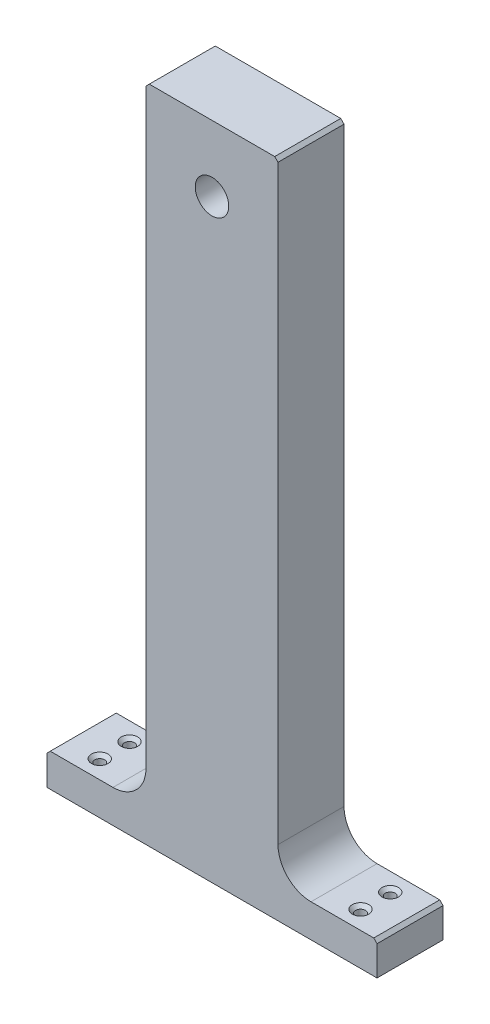
ISO-10303-21;
HEADER;
FILE_DESCRIPTION(('STEP AP214'),'2;1');
FILE_NAME('part.step','',(''),(''),'','','');
FILE_SCHEMA(('AUTOMOTIVE_DESIGN { 1 0 10303 214 1 1 1 1 }'));
ENDSEC;
DATA;
#1=APPLICATION_CONTEXT('core data for automotive mechanical design processes');
#2=APPLICATION_PROTOCOL_DEFINITION('international standard','automotive_design',2000,#1);
#3=PRODUCT_CONTEXT('',#1,'mechanical');
#4=PRODUCT('Part','Part','',(#3));
#5=PRODUCT_RELATED_PRODUCT_CATEGORY('part','',(#4));
#6=PRODUCT_DEFINITION_FORMATION('','',#4);
#7=PRODUCT_DEFINITION_CONTEXT('part definition',#1,'design');
#8=PRODUCT_DEFINITION('design','',#6,#7);
#9=PRODUCT_DEFINITION_SHAPE('','',#8);
#10=(LENGTH_UNIT() NAMED_UNIT(*) SI_UNIT(.MILLI.,.METRE.));
#11=(NAMED_UNIT(*) PLANE_ANGLE_UNIT() SI_UNIT($,.RADIAN.));
#12=(NAMED_UNIT(*) SI_UNIT($,.STERADIAN.) SOLID_ANGLE_UNIT());
#13=UNCERTAINTY_MEASURE_WITH_UNIT(LENGTH_MEASURE(1.E-05),#10,'distance_accuracy_value','');
#14=(GEOMETRIC_REPRESENTATION_CONTEXT(3) GLOBAL_UNCERTAINTY_ASSIGNED_CONTEXT((#13)) GLOBAL_UNIT_ASSIGNED_CONTEXT((#10,
#11,#12)) REPRESENTATION_CONTEXT('',''));
#15=CARTESIAN_POINT('',(0.,0.,0.));
#16=DIRECTION('',(0.,0.,1.));
#17=DIRECTION('',(1.,0.,0.));
#18=AXIS2_PLACEMENT_3D('',#15,#16,#17);
#19=CARTESIAN_POINT('',(158.68544600939,16.4301183127146,20.));
#20=DIRECTION('',(0.,1.,0.));
#21=DIRECTION('',(0.,0.,1.));
#22=AXIS2_PLACEMENT_3D('',#19,#20,#21);
#23=PLANE('',#22);
#24=CARTESIAN_POINT('',(178.18544600939,16.4301183127146,5.5));
#25=DIRECTION('',(0.,1.,0.));
#26=DIRECTION('',(0.,0.,1.));
#27=AXIS2_PLACEMENT_3D('',#24,#25,#26);
#28=CIRCLE('',#27,1.5);
#29=CARTESIAN_POINT('',(178.18544600939,16.4301183127146,7.));
#30=VERTEX_POINT('',#29);
#31=EDGE_CURVE('E224',#30,#30,#28,.T.);
#32=ORIENTED_EDGE('',*,*,#31,.T.);
#33=EDGE_LOOP('',(#32));
#34=FACE_BOUND('',#33,.T.);
#35=CARTESIAN_POINT('',(178.18544600939,16.4301183127146,14.5));
#36=DIRECTION('',(0.,1.,0.));
#37=DIRECTION('',(0.,0.,1.));
#38=AXIS2_PLACEMENT_3D('',#35,#36,#37);
#39=CIRCLE('',#38,1.5);
#40=CARTESIAN_POINT('',(178.18544600939,16.4301183127146,16.));
#41=VERTEX_POINT('',#40);
#42=EDGE_CURVE('E221',#41,#41,#39,.T.);
#43=ORIENTED_EDGE('',*,*,#42,.T.);
#44=EDGE_LOOP('',(#43));
#45=FACE_BOUND('',#44,.T.);
#46=DIRECTION('',(1.,0.,0.));
#47=VECTOR('',#46,1.);
#48=CARTESIAN_POINT('',(158.68544600939,16.4301183127146,0.));
#49=LINE('',#48,#47);
#50=CARTESIAN_POINT('',(88.6854460093897,16.4301183127146,0.));
#51=VERTEX_POINT('',#50);
#52=CARTESIAN_POINT('',(188.68544600939,16.4301183127146,0.));
#53=VERTEX_POINT('',#52);
#54=EDGE_CURVE('E226',#51,#53,#49,.T.);
#55=ORIENTED_EDGE('',*,*,#54,.T.);
#56=DIRECTION('',(0.,0.,-1.));
#57=VECTOR('',#56,1.);
#58=CARTESIAN_POINT('',(188.68544600939,16.4301183127146,20.));
#59=LINE('',#58,#57);
#60=CARTESIAN_POINT('',(188.68544600939,16.4301183127146,20.));
#61=VERTEX_POINT('',#60);
#62=EDGE_CURVE('E151',#61,#53,#59,.T.);
#63=ORIENTED_EDGE('',*,*,#62,.F.);
#64=DIRECTION('',(1.,0.,0.));
#65=VECTOR('',#64,1.);
#66=CARTESIAN_POINT('',(138.68544600939,16.4301183127146,20.));
#67=LINE('',#66,#65);
#68=CARTESIAN_POINT('',(88.6854460093897,16.4301183127146,20.));
#69=VERTEX_POINT('',#68);
#70=EDGE_CURVE('E145',#69,#61,#67,.T.);
#71=ORIENTED_EDGE('',*,*,#70,.F.);
#72=DIRECTION('',(0.,0.,-1.));
#73=VECTOR('',#72,1.);
#74=CARTESIAN_POINT('',(88.6854460093897,16.4301183127146,20.));
#75=LINE('',#74,#73);
#76=EDGE_CURVE('E149',#69,#51,#75,.T.);
#77=ORIENTED_EDGE('',*,*,#76,.T.);
#78=EDGE_LOOP('',(#55,#63,#71,#77));
#79=FACE_BOUND('',#78,.T.);
#80=CARTESIAN_POINT('',(99.1854460093897,16.4301183127146,5.5));
#81=DIRECTION('',(0.,-1.,0.));
#82=DIRECTION('',(0.,0.,1.));
#83=AXIS2_PLACEMENT_3D('',#80,#81,#82);
#84=CIRCLE('',#83,1.5);
#85=CARTESIAN_POINT('',(99.1854460093897,16.4301183127146,7.));
#86=VERTEX_POINT('',#85);
#87=EDGE_CURVE('E368',#86,#86,#84,.T.);
#88=ORIENTED_EDGE('',*,*,#87,.F.);
#89=EDGE_LOOP('',(#88));
#90=FACE_BOUND('',#89,.T.);
#91=CARTESIAN_POINT('',(99.1854460093897,16.4301183127146,14.5));
#92=DIRECTION('',(0.,-1.,0.));
#93=DIRECTION('',(0.,0.,1.));
#94=AXIS2_PLACEMENT_3D('',#91,#92,#93);
#95=CIRCLE('',#94,1.5);
#96=CARTESIAN_POINT('',(99.1854460093897,16.4301183127146,16.));
#97=VERTEX_POINT('',#96);
#98=EDGE_CURVE('E569',#97,#97,#95,.T.);
#99=ORIENTED_EDGE('',*,*,#98,.F.);
#100=EDGE_LOOP('',(#99));
#101=FACE_BOUND('',#100,.T.);
#102=ADVANCED_FACE('F41',(#34,#45,#79,#90,#101),#23,.F.);
#103=CARTESIAN_POINT('',(188.68544600939,16.4301183127146,20.));
#104=DIRECTION('',(-1.,0.,0.));
#105=DIRECTION('',(0.,0.,1.));
#106=AXIS2_PLACEMENT_3D('',#103,#104,#105);
#107=PLANE('',#106);
#108=DIRECTION('',(0.,1.,0.));
#109=VECTOR('',#108,1.);
#110=CARTESIAN_POINT('',(188.68544600939,16.4301183127146,0.));
#111=LINE('',#110,#109);
#112=CARTESIAN_POINT('',(188.68544600939,25.4301183127146,0.));
#113=VERTEX_POINT('',#112);
#114=EDGE_CURVE('E239',#53,#113,#111,.T.);
#115=ORIENTED_EDGE('',*,*,#114,.T.);
#116=DIRECTION('',(0.,0.,1.));
#117=VECTOR('',#116,1.);
#118=CARTESIAN_POINT('',(188.68544600939,25.4301183127146,20.));
#119=LINE('',#118,#117);
#120=CARTESIAN_POINT('',(188.68544600939,25.4301183127146,20.));
#121=VERTEX_POINT('',#120);
#122=EDGE_CURVE('E269',#113,#121,#119,.T.);
#123=ORIENTED_EDGE('',*,*,#122,.T.);
#124=DIRECTION('',(0.,1.,0.));
#125=VECTOR('',#124,1.);
#126=CARTESIAN_POINT('',(188.68544600939,16.4301183127146,20.));
#127=LINE('',#126,#125);
#128=EDGE_CURVE('E154',#61,#121,#127,.T.);
#129=ORIENTED_EDGE('',*,*,#128,.F.);
#130=ORIENTED_EDGE('',*,*,#62,.T.);
#131=EDGE_LOOP('',(#115,#123,#129,#130));
#132=FACE_BOUND('',#131,.T.);
#133=ADVANCED_FACE('F303',(#132),#107,.F.);
#134=CARTESIAN_POINT('',(158.68544600939,26.4301183127146,20.));
#135=DIRECTION('',(0.,-1.,0.));
#136=DIRECTION('',(0.,0.,-1.));
#137=AXIS2_PLACEMENT_3D('',#134,#135,#136);
#138=PLANE('',#137);
#139=CARTESIAN_POINT('',(178.18544600939,26.4301183127146,14.5));
#140=DIRECTION('',(0.,-1.,0.));
#141=DIRECTION('',(0.,0.,-1.));
#142=AXIS2_PLACEMENT_3D('',#139,#140,#141);
#143=CIRCLE('',#142,2.49999999999997);
#144=CARTESIAN_POINT('',(178.18544600939,26.4301183127146,12.));
#145=VERTEX_POINT('',#144);
#146=EDGE_CURVE('E50',#145,#145,#143,.T.);
#147=ORIENTED_EDGE('',*,*,#146,.T.);
#148=EDGE_LOOP('',(#147));
#149=FACE_BOUND('',#148,.T.);
#150=CARTESIAN_POINT('',(178.18544600939,26.4301183127146,5.5));
#151=DIRECTION('',(0.,-1.,0.));
#152=DIRECTION('',(0.,0.,-1.));
#153=AXIS2_PLACEMENT_3D('',#150,#151,#152);
#154=CIRCLE('',#153,2.49999999999998);
#155=CARTESIAN_POINT('',(178.18544600939,26.4301183127146,3.00000000000003));
#156=VERTEX_POINT('',#155);
#157=EDGE_CURVE('E281',#156,#156,#154,.T.);
#158=ORIENTED_EDGE('',*,*,#157,.T.);
#159=EDGE_LOOP('',(#158));
#160=FACE_BOUND('',#159,.T.);
#161=DIRECTION('',(-1.,0.,0.));
#162=VECTOR('',#161,1.);
#163=CARTESIAN_POINT('',(158.68544600939,26.4301183127146,20.));
#164=LINE('',#163,#162);
#165=CARTESIAN_POINT('',(187.68544600939,26.4301183127146,20.));
#166=VERTEX_POINT('',#165);
#167=CARTESIAN_POINT('',(168.68544600939,26.4301183127146,20.));
#168=VERTEX_POINT('',#167);
#169=EDGE_CURVE('E229',#166,#168,#164,.T.);
#170=ORIENTED_EDGE('',*,*,#169,.F.);
#171=DIRECTION('',(0.,0.,-1.));
#172=VECTOR('',#171,1.);
#173=CARTESIAN_POINT('',(187.68544600939,26.4301183127146,20.));
#174=LINE('',#173,#172);
#175=CARTESIAN_POINT('',(187.68544600939,26.4301183127146,0.));
#176=VERTEX_POINT('',#175);
#177=EDGE_CURVE('E262',#166,#176,#174,.T.);
#178=ORIENTED_EDGE('',*,*,#177,.T.);
#179=DIRECTION('',(-1.,0.,0.));
#180=VECTOR('',#179,1.);
#181=CARTESIAN_POINT('',(158.68544600939,26.4301183127146,0.));
#182=LINE('',#181,#180);
#183=CARTESIAN_POINT('',(168.68544600939,26.4301183127146,0.));
#184=VERTEX_POINT('',#183);
#185=EDGE_CURVE('E242',#176,#184,#182,.T.);
#186=ORIENTED_EDGE('',*,*,#185,.T.);
#187=DIRECTION('',(0.,0.,-1.));
#188=VECTOR('',#187,1.);
#189=CARTESIAN_POINT('',(168.68544600939,26.4301183127146,20.));
#190=LINE('',#189,#188);
#191=EDGE_CURVE('E254',#184,#168,#190,.F.);
#192=ORIENTED_EDGE('',*,*,#191,.T.);
#193=EDGE_LOOP('',(#170,#178,#186,#192));
#194=FACE_BOUND('',#193,.T.);
#195=ADVANCED_FACE('F286',(#149,#160,#194),#138,.F.);
#196=CARTESIAN_POINT('',(158.68544600939,26.4301183127146,20.));
#197=DIRECTION('',(-1.,0.,0.));
#198=DIRECTION('',(0.,0.,1.));
#199=AXIS2_PLACEMENT_3D('',#196,#197,#198);
#200=PLANE('',#199);
#201=DIRECTION('',(0.,1.,0.));
#202=VECTOR('',#201,1.);
#203=CARTESIAN_POINT('',(158.68544600939,26.4301183127146,0.));
#204=LINE('',#203,#202);
#205=CARTESIAN_POINT('',(158.68544600939,36.4301183127146,0.));
#206=VERTEX_POINT('',#205);
#207=CARTESIAN_POINT('',(158.68544600939,215.430118312715,0.));
#208=VERTEX_POINT('',#207);
#209=EDGE_CURVE('E244',#206,#208,#204,.T.);
#210=ORIENTED_EDGE('',*,*,#209,.T.);
#211=DIRECTION('',(0.,0.,1.));
#212=VECTOR('',#211,1.);
#213=CARTESIAN_POINT('',(158.68544600939,215.430118312715,20.));
#214=LINE('',#213,#212);
#215=CARTESIAN_POINT('',(158.68544600939,215.430118312715,20.));
#216=VERTEX_POINT('',#215);
#217=EDGE_CURVE('E65',#208,#216,#214,.T.);
#218=ORIENTED_EDGE('',*,*,#217,.T.);
#219=DIRECTION('',(0.,1.,0.));
#220=VECTOR('',#219,1.);
#221=CARTESIAN_POINT('',(158.68544600939,26.4301183127146,20.));
#222=LINE('',#221,#220);
#223=CARTESIAN_POINT('',(158.68544600939,36.4301183127146,20.));
#224=VERTEX_POINT('',#223);
#225=EDGE_CURVE('E231',#224,#216,#222,.T.);
#226=ORIENTED_EDGE('',*,*,#225,.F.);
#227=DIRECTION('',(0.,0.,-1.));
#228=VECTOR('',#227,1.);
#229=CARTESIAN_POINT('',(158.68544600939,36.4301183127146,0.));
#230=LINE('',#229,#228);
#231=EDGE_CURVE('E251',#224,#206,#230,.T.);
#232=ORIENTED_EDGE('',*,*,#231,.T.);
#233=EDGE_LOOP('',(#210,#218,#226,#232));
#234=FACE_BOUND('',#233,.T.);
#235=ADVANCED_FACE('F404',(#234),#200,.F.);
#236=CARTESIAN_POINT('',(138.68544600939,216.430118312715,20.));
#237=DIRECTION('',(0.,-1.,0.));
#238=DIRECTION('',(0.,0.,-1.));
#239=AXIS2_PLACEMENT_3D('',#236,#237,#238);
#240=PLANE('',#239);
#241=DIRECTION('',(-1.,0.,0.));
#242=VECTOR('',#241,1.);
#243=CARTESIAN_POINT('',(138.68544600939,216.430118312715,20.));
#244=LINE('',#243,#242);
#245=CARTESIAN_POINT('',(157.68544600939,216.430118312715,20.));
#246=VERTEX_POINT('',#245);
#247=CARTESIAN_POINT('',(119.68544600939,216.430118312715,20.));
#248=VERTEX_POINT('',#247);
#249=EDGE_CURVE('E233',#246,#248,#244,.T.);
#250=ORIENTED_EDGE('',*,*,#249,.F.);
#251=DIRECTION('',(0.,0.,-1.));
#252=VECTOR('',#251,1.);
#253=CARTESIAN_POINT('',(157.68544600939,216.430118312715,20.));
#254=LINE('',#253,#252);
#255=CARTESIAN_POINT('',(157.68544600939,216.430118312715,0.));
#256=VERTEX_POINT('',#255);
#257=EDGE_CURVE('E274',#246,#256,#254,.T.);
#258=ORIENTED_EDGE('',*,*,#257,.T.);
#259=DIRECTION('',(-1.,0.,0.));
#260=VECTOR('',#259,1.);
#261=CARTESIAN_POINT('',(138.68544600939,216.430118312715,0.));
#262=LINE('',#261,#260);
#263=CARTESIAN_POINT('',(119.68544600939,216.430118312715,0.));
#264=VERTEX_POINT('',#263);
#265=EDGE_CURVE('E246',#256,#264,#262,.T.);
#266=ORIENTED_EDGE('',*,*,#265,.T.);
#267=DIRECTION('',(0.,0.,-1.));
#268=VECTOR('',#267,1.);
#269=CARTESIAN_POINT('',(119.68544600939,216.430118312715,20.));
#270=LINE('',#269,#268);
#271=EDGE_CURVE('E203',#248,#264,#270,.T.);
#272=ORIENTED_EDGE('',*,*,#271,.F.);
#273=EDGE_LOOP('',(#250,#258,#266,#272));
#274=FACE_BOUND('',#273,.T.);
#275=ADVANCED_FACE('F340',(#274),#240,.F.);
#276=CARTESIAN_POINT('',(138.68544600939,196.430118312715,20.));
#277=DIRECTION('',(0.,0.,-1.));
#278=DIRECTION('',(-1.,0.,0.));
#279=AXIS2_PLACEMENT_3D('',#276,#277,#278);
#280=CYLINDRICAL_SURFACE('',#279,5.075);
#281=CARTESIAN_POINT('',(138.68544600939,196.430118312715,0.));
#282=DIRECTION('',(0.,0.,-1.));
#283=DIRECTION('',(1.,0.,0.));
#284=AXIS2_PLACEMENT_3D('',#281,#282,#283);
#285=CIRCLE('',#284,5.075);
#286=CARTESIAN_POINT('',(143.76044600939,196.430118312715,0.));
#287=VERTEX_POINT('',#286);
#288=EDGE_CURVE('E155',#287,#287,#285,.T.);
#289=ORIENTED_EDGE('',*,*,#288,.T.);
#290=EDGE_LOOP('',(#289));
#291=FACE_BOUND('',#290,.T.);
#292=CARTESIAN_POINT('',(138.68544600939,196.430118312715,20.));
#293=DIRECTION('',(0.,0.,-1.));
#294=DIRECTION('',(1.,0.,0.));
#295=AXIS2_PLACEMENT_3D('',#292,#293,#294);
#296=CIRCLE('',#295,5.075);
#297=CARTESIAN_POINT('',(143.76044600939,196.430118312715,20.));
#298=VERTEX_POINT('',#297);
#299=EDGE_CURVE('E235',#298,#298,#296,.T.);
#300=ORIENTED_EDGE('',*,*,#299,.F.);
#301=EDGE_LOOP('',(#300));
#302=FACE_BOUND('',#301,.T.);
#303=ADVANCED_FACE('F396',(#291,#302),#280,.F.);
#304=CARTESIAN_POINT('',(138.68544600939,196.430118312715,20.));
#305=DIRECTION('',(0.,0.,1.));
#306=DIRECTION('',(1.,0.,0.));
#307=AXIS2_PLACEMENT_3D('',#304,#305,#306);
#308=PLANE('',#307);
#309=DIRECTION('',(0.,1.,0.));
#310=VECTOR('',#309,1.);
#311=CARTESIAN_POINT('',(88.6854460093897,16.4301183127146,20.));
#312=LINE('',#311,#310);
#313=CARTESIAN_POINT('',(88.6854460093897,25.4301183127146,20.));
#314=VERTEX_POINT('',#313);
#315=EDGE_CURVE('E158',#69,#314,#312,.T.);
#316=ORIENTED_EDGE('',*,*,#315,.F.);
#317=ORIENTED_EDGE('',*,*,#70,.T.);
#318=ORIENTED_EDGE('',*,*,#128,.T.);
#319=DIRECTION('',(0.707106781186548,-0.707106781186548,0.));
#320=VECTOR('',#319,1.);
#321=CARTESIAN_POINT('',(78.1854460093897,135.930118312715,20.));
#322=LINE('',#321,#320);
#323=EDGE_CURVE('E272',#121,#166,#322,.F.);
#324=ORIENTED_EDGE('',*,*,#323,.T.);
#325=ORIENTED_EDGE('',*,*,#169,.T.);
#326=CARTESIAN_POINT('',(168.68544600939,36.4301183127146,20.));
#327=DIRECTION('',(0.,0.,1.));
#328=DIRECTION('',(1.,0.,0.));
#329=AXIS2_PLACEMENT_3D('',#326,#327,#328);
#330=CIRCLE('',#329,10.);
#331=EDGE_CURVE('E260',#168,#224,#330,.F.);
#332=ORIENTED_EDGE('',*,*,#331,.T.);
#333=ORIENTED_EDGE('',*,*,#225,.T.);
#334=DIRECTION('',(0.707106781186548,-0.707106781186548,0.));
#335=VECTOR('',#334,1.);
#336=CARTESIAN_POINT('',(158.18544600939,215.930118312715,20.));
#337=LINE('',#336,#335);
#338=EDGE_CURVE('E57',#216,#246,#337,.F.);
#339=ORIENTED_EDGE('',*,*,#338,.T.);
#340=ORIENTED_EDGE('',*,*,#249,.T.);
#341=DIRECTION('',(-0.707106781186548,-0.707106781186548,0.));
#342=VECTOR('',#341,1.);
#343=CARTESIAN_POINT('',(119.18544600939,215.930118312715,20.));
#344=LINE('',#343,#342);
#345=CARTESIAN_POINT('',(118.68544600939,215.430118312715,20.));
#346=VERTEX_POINT('',#345);
#347=EDGE_CURVE('E199',#346,#248,#344,.F.);
#348=ORIENTED_EDGE('',*,*,#347,.F.);
#349=DIRECTION('',(0.,1.,0.));
#350=VECTOR('',#349,1.);
#351=CARTESIAN_POINT('',(118.68544600939,26.4301183127146,20.));
#352=LINE('',#351,#350);
#353=CARTESIAN_POINT('',(118.68544600939,36.4301183127146,20.));
#354=VERTEX_POINT('',#353);
#355=EDGE_CURVE('E174',#354,#346,#352,.T.);
#356=ORIENTED_EDGE('',*,*,#355,.F.);
#357=CARTESIAN_POINT('',(108.68544600939,36.4301183127146,20.));
#358=DIRECTION('',(0.,0.,-1.));
#359=DIRECTION('',(-1.,0.,0.));
#360=AXIS2_PLACEMENT_3D('',#357,#358,#359);
#361=CIRCLE('',#360,10.);
#362=CARTESIAN_POINT('',(108.68544600939,26.4301183127146,20.));
#363=VERTEX_POINT('',#362);
#364=EDGE_CURVE('E188',#363,#354,#361,.F.);
#365=ORIENTED_EDGE('',*,*,#364,.F.);
#366=DIRECTION('',(1.,0.,0.));
#367=VECTOR('',#366,1.);
#368=CARTESIAN_POINT('',(118.68544600939,26.4301183127146,20.));
#369=LINE('',#368,#367);
#370=CARTESIAN_POINT('',(89.6854460093897,26.4301183127146,20.));
#371=VERTEX_POINT('',#370);
#372=EDGE_CURVE('E166',#371,#363,#369,.T.);
#373=ORIENTED_EDGE('',*,*,#372,.F.);
#374=DIRECTION('',(-0.707106781186548,-0.707106781186548,0.));
#375=VECTOR('',#374,1.);
#376=CARTESIAN_POINT('',(199.18544600939,135.930118312715,20.));
#377=LINE('',#376,#375);
#378=EDGE_CURVE('E162',#314,#371,#377,.F.);
#379=ORIENTED_EDGE('',*,*,#378,.F.);
#380=EDGE_LOOP('',(#316,#317,#318,#324,#325,#332,#333,#339,#340,#348,#356,#365,#373,#379));
#381=FACE_BOUND('',#380,.T.);
#382=ORIENTED_EDGE('',*,*,#299,.T.);
#383=EDGE_LOOP('',(#382));
#384=FACE_BOUND('',#383,.T.);
#385=ADVANCED_FACE('F159',(#381,#384),#308,.T.);
#386=CARTESIAN_POINT('',(138.68544600939,196.430118312715,0.));
#387=DIRECTION('',(0.,0.,1.));
#388=DIRECTION('',(1.,0.,0.));
#389=AXIS2_PLACEMENT_3D('',#386,#387,#388);
#390=PLANE('',#389);
#391=ORIENTED_EDGE('',*,*,#54,.F.);
#392=DIRECTION('',(0.,1.,0.));
#393=VECTOR('',#392,1.);
#394=CARTESIAN_POINT('',(88.6854460093897,16.4301183127146,0.));
#395=LINE('',#394,#393);
#396=CARTESIAN_POINT('',(88.6854460093897,25.4301183127146,0.));
#397=VERTEX_POINT('',#396);
#398=EDGE_CURVE('E172',#51,#397,#395,.T.);
#399=ORIENTED_EDGE('',*,*,#398,.T.);
#400=DIRECTION('',(0.707106781186548,0.707106781186548,0.));
#401=VECTOR('',#400,1.);
#402=CARTESIAN_POINT('',(89.6854460093897,26.4301183127146,0.));
#403=LINE('',#402,#401);
#404=CARTESIAN_POINT('',(89.6854460093897,26.4301183127146,0.));
#405=VERTEX_POINT('',#404);
#406=EDGE_CURVE('E195',#405,#397,#403,.F.);
#407=ORIENTED_EDGE('',*,*,#406,.F.);
#408=DIRECTION('',(1.,0.,0.));
#409=VECTOR('',#408,1.);
#410=CARTESIAN_POINT('',(118.68544600939,26.4301183127146,0.));
#411=LINE('',#410,#409);
#412=CARTESIAN_POINT('',(108.68544600939,26.4301183127146,0.));
#413=VERTEX_POINT('',#412);
#414=EDGE_CURVE('E367',#405,#413,#411,.T.);
#415=ORIENTED_EDGE('',*,*,#414,.T.);
#416=CARTESIAN_POINT('',(108.68544600939,36.4301183127146,0.));
#417=DIRECTION('',(0.,0.,-1.));
#418=DIRECTION('',(-1.,0.,0.));
#419=AXIS2_PLACEMENT_3D('',#416,#417,#418);
#420=CIRCLE('',#419,10.);
#421=CARTESIAN_POINT('',(118.68544600939,36.4301183127146,0.));
#422=VERTEX_POINT('',#421);
#423=EDGE_CURVE('E186',#422,#413,#420,.T.);
#424=ORIENTED_EDGE('',*,*,#423,.F.);
#425=DIRECTION('',(0.,1.,0.));
#426=VECTOR('',#425,1.);
#427=CARTESIAN_POINT('',(118.68544600939,26.4301183127146,0.));
#428=LINE('',#427,#426);
#429=CARTESIAN_POINT('',(118.68544600939,215.430118312715,0.));
#430=VERTEX_POINT('',#429);
#431=EDGE_CURVE('E167',#422,#430,#428,.T.);
#432=ORIENTED_EDGE('',*,*,#431,.T.);
#433=DIRECTION('',(0.707106781186548,0.707106781186548,0.));
#434=VECTOR('',#433,1.);
#435=CARTESIAN_POINT('',(119.68544600939,216.430118312715,0.));
#436=LINE('',#435,#434);
#437=EDGE_CURVE('E193',#264,#430,#436,.F.);
#438=ORIENTED_EDGE('',*,*,#437,.F.);
#439=ORIENTED_EDGE('',*,*,#265,.F.);
#440=DIRECTION('',(-0.707106781186548,0.707106781186548,0.));
#441=VECTOR('',#440,1.);
#442=CARTESIAN_POINT('',(157.68544600939,216.430118312715,0.));
#443=LINE('',#442,#441);
#444=EDGE_CURVE('E265',#256,#208,#443,.F.);
#445=ORIENTED_EDGE('',*,*,#444,.T.);
#446=ORIENTED_EDGE('',*,*,#209,.F.);
#447=CARTESIAN_POINT('',(168.68544600939,36.4301183127146,0.));
#448=DIRECTION('',(0.,0.,1.));
#449=DIRECTION('',(1.,0.,0.));
#450=AXIS2_PLACEMENT_3D('',#447,#448,#449);
#451=CIRCLE('',#450,10.);
#452=EDGE_CURVE('E257',#206,#184,#451,.T.);
#453=ORIENTED_EDGE('',*,*,#452,.T.);
#454=ORIENTED_EDGE('',*,*,#185,.F.);
#455=DIRECTION('',(-0.707106781186548,0.707106781186548,0.));
#456=VECTOR('',#455,1.);
#457=CARTESIAN_POINT('',(187.68544600939,26.4301183127146,0.));
#458=LINE('',#457,#456);
#459=EDGE_CURVE('E267',#176,#113,#458,.F.);
#460=ORIENTED_EDGE('',*,*,#459,.T.);
#461=ORIENTED_EDGE('',*,*,#114,.F.);
#462=EDGE_LOOP('',(#391,#399,#407,#415,#424,#432,#438,#439,#445,#446,#453,#454,#460,#461));
#463=FACE_BOUND('',#462,.T.);
#464=ORIENTED_EDGE('',*,*,#288,.F.);
#465=EDGE_LOOP('',(#464));
#466=FACE_BOUND('',#465,.T.);
#467=ADVANCED_FACE('F317',(#463,#466),#390,.F.);
#468=CARTESIAN_POINT('',(168.68544600939,36.4301183127146,20.));
#469=DIRECTION('',(0.,0.,1.));
#470=DIRECTION('',(1.,0.,0.));
#471=AXIS2_PLACEMENT_3D('',#468,#469,#470);
#472=CYLINDRICAL_SURFACE('',#471,10.);
#473=ORIENTED_EDGE('',*,*,#331,.F.);
#474=ORIENTED_EDGE('',*,*,#191,.F.);
#475=ORIENTED_EDGE('',*,*,#452,.F.);
#476=ORIENTED_EDGE('',*,*,#231,.F.);
#477=EDGE_LOOP('',(#473,#474,#475,#476));
#478=FACE_BOUND('',#477,.T.);
#479=ADVANCED_FACE('F313',(#478),#472,.F.);
#480=CARTESIAN_POINT('',(187.68544600939,26.4301183127146,20.));
#481=DIRECTION('',(-0.707106781186547,-0.707106781186547,0.));
#482=DIRECTION('',(0.,0.,-1.));
#483=AXIS2_PLACEMENT_3D('',#480,#481,#482);
#484=PLANE('',#483);
#485=ORIENTED_EDGE('',*,*,#323,.F.);
#486=ORIENTED_EDGE('',*,*,#122,.F.);
#487=ORIENTED_EDGE('',*,*,#459,.F.);
#488=ORIENTED_EDGE('',*,*,#177,.F.);
#489=EDGE_LOOP('',(#485,#486,#487,#488));
#490=FACE_BOUND('',#489,.T.);
#491=ADVANCED_FACE('F316',(#490),#484,.F.);
#492=CARTESIAN_POINT('',(157.68544600939,216.430118312715,20.));
#493=DIRECTION('',(-0.707106781186548,-0.707106781186548,0.));
#494=DIRECTION('',(0.,0.,-1.));
#495=AXIS2_PLACEMENT_3D('',#492,#493,#494);
#496=PLANE('',#495);
#497=ORIENTED_EDGE('',*,*,#338,.F.);
#498=ORIENTED_EDGE('',*,*,#217,.F.);
#499=ORIENTED_EDGE('',*,*,#444,.F.);
#500=ORIENTED_EDGE('',*,*,#257,.F.);
#501=EDGE_LOOP('',(#497,#498,#499,#500));
#502=FACE_BOUND('',#501,.T.);
#503=ADVANCED_FACE('F298',(#502),#496,.F.);
#504=CARTESIAN_POINT('',(178.18544600939,6.43011831271463,14.5));
#505=DIRECTION('',(0.,1.,0.));
#506=DIRECTION('',(0.,0.,1.));
#507=AXIS2_PLACEMENT_3D('',#504,#505,#506);
#508=CYLINDRICAL_SURFACE('',#507,1.5);
#509=CARTESIAN_POINT('',(178.18544600939,25.4301183127147,14.5));
#510=DIRECTION('',(0.,-1.,0.));
#511=DIRECTION('',(0.,0.,-1.));
#512=AXIS2_PLACEMENT_3D('',#509,#510,#511);
#513=CIRCLE('',#512,1.5);
#514=CARTESIAN_POINT('',(178.18544600939,25.4301183127147,13.));
#515=VERTEX_POINT('',#514);
#516=EDGE_CURVE('E278',#515,#515,#513,.F.);
#517=ORIENTED_EDGE('',*,*,#516,.T.);
#518=EDGE_LOOP('',(#517));
#519=FACE_BOUND('',#518,.T.);
#520=ORIENTED_EDGE('',*,*,#42,.F.);
#521=EDGE_LOOP('',(#520));
#522=FACE_BOUND('',#521,.T.);
#523=ADVANCED_FACE('F295',(#519,#522),#508,.F.);
#524=CARTESIAN_POINT('',(178.18544600939,6.43011831271463,5.5));
#525=DIRECTION('',(0.,1.,0.));
#526=DIRECTION('',(0.,0.,1.));
#527=AXIS2_PLACEMENT_3D('',#524,#525,#526);
#528=CYLINDRICAL_SURFACE('',#527,1.5);
#529=CARTESIAN_POINT('',(178.18544600939,25.4301183127147,5.5));
#530=DIRECTION('',(0.,-1.,0.));
#531=DIRECTION('',(0.,0.,-1.));
#532=AXIS2_PLACEMENT_3D('',#529,#530,#531);
#533=CIRCLE('',#532,1.5);
#534=CARTESIAN_POINT('',(178.18544600939,25.4301183127147,4.00000000000001));
#535=VERTEX_POINT('',#534);
#536=EDGE_CURVE('E11',#535,#535,#533,.F.);
#537=ORIENTED_EDGE('',*,*,#536,.T.);
#538=EDGE_LOOP('',(#537));
#539=FACE_BOUND('',#538,.T.);
#540=ORIENTED_EDGE('',*,*,#31,.F.);
#541=EDGE_LOOP('',(#540));
#542=FACE_BOUND('',#541,.T.);
#543=ADVANCED_FACE('F292',(#539,#542),#528,.F.);
#544=CARTESIAN_POINT('',(178.18544600939,25.4301183127147,14.5));
#545=DIRECTION('',(0.,1.,0.));
#546=DIRECTION('',(0.,0.,1.));
#547=AXIS2_PLACEMENT_3D('',#544,#545,#546);
#548=CONICAL_SURFACE('',#547,1.5,0.785398163397459);
#549=ORIENTED_EDGE('',*,*,#146,.F.);
#550=EDGE_LOOP('',(#549));
#551=FACE_BOUND('',#550,.T.);
#552=ORIENTED_EDGE('',*,*,#516,.F.);
#553=EDGE_LOOP('',(#552));
#554=FACE_BOUND('',#553,.T.);
#555=ADVANCED_FACE('F289',(#551,#554),#548,.F.);
#556=CARTESIAN_POINT('',(178.18544600939,25.4301183127147,5.5));
#557=DIRECTION('',(0.,1.,0.));
#558=DIRECTION('',(0.,0.,1.));
#559=AXIS2_PLACEMENT_3D('',#556,#557,#558);
#560=CONICAL_SURFACE('',#559,1.5,0.785398163397445);
#561=ORIENTED_EDGE('',*,*,#157,.F.);
#562=EDGE_LOOP('',(#561));
#563=FACE_BOUND('',#562,.T.);
#564=ORIENTED_EDGE('',*,*,#536,.F.);
#565=EDGE_LOOP('',(#564));
#566=FACE_BOUND('',#565,.T.);
#567=ADVANCED_FACE('F44',(#563,#566),#560,.F.);
#568=CARTESIAN_POINT('',(88.6854460093897,16.4301183127146,20.));
#569=DIRECTION('',(1.,0.,0.));
#570=DIRECTION('',(0.,0.,1.));
#571=AXIS2_PLACEMENT_3D('',#568,#569,#570);
#572=PLANE('',#571);
#573=ORIENTED_EDGE('',*,*,#398,.F.);
#574=ORIENTED_EDGE('',*,*,#76,.F.);
#575=ORIENTED_EDGE('',*,*,#315,.T.);
#576=DIRECTION('',(0.,0.,1.));
#577=VECTOR('',#576,1.);
#578=CARTESIAN_POINT('',(88.6854460093897,25.4301183127146,20.));
#579=LINE('',#578,#577);
#580=EDGE_CURVE('E197',#397,#314,#579,.T.);
#581=ORIENTED_EDGE('',*,*,#580,.F.);
#582=EDGE_LOOP('',(#573,#574,#575,#581));
#583=FACE_BOUND('',#582,.T.);
#584=ADVANCED_FACE('F170',(#583),#572,.F.);
#585=CARTESIAN_POINT('',(118.68544600939,26.4301183127146,20.));
#586=DIRECTION('',(0.,-1.,0.));
#587=DIRECTION('',(0.,0.,-1.));
#588=AXIS2_PLACEMENT_3D('',#585,#586,#587);
#589=PLANE('',#588);
#590=CARTESIAN_POINT('',(99.1854460093897,26.4301183127146,14.5));
#591=DIRECTION('',(0.,1.,0.));
#592=DIRECTION('',(0.,0.,-1.));
#593=AXIS2_PLACEMENT_3D('',#590,#591,#592);
#594=CIRCLE('',#593,2.49999999999997);
#595=CARTESIAN_POINT('',(99.1854460093897,26.4301183127146,12.));
#596=VERTEX_POINT('',#595);
#597=EDGE_CURVE('E215',#596,#596,#594,.T.);
#598=ORIENTED_EDGE('',*,*,#597,.F.);
#599=EDGE_LOOP('',(#598));
#600=FACE_BOUND('',#599,.T.);
#601=CARTESIAN_POINT('',(99.1854460093897,26.4301183127146,5.5));
#602=DIRECTION('',(0.,1.,0.));
#603=DIRECTION('',(0.,0.,-1.));
#604=AXIS2_PLACEMENT_3D('',#601,#602,#603);
#605=CIRCLE('',#604,2.49999999999998);
#606=CARTESIAN_POINT('',(99.1854460093897,26.4301183127146,3.00000000000003));
#607=VERTEX_POINT('',#606);
#608=EDGE_CURVE('E212',#607,#607,#605,.T.);
#609=ORIENTED_EDGE('',*,*,#608,.F.);
#610=EDGE_LOOP('',(#609));
#611=FACE_BOUND('',#610,.T.);
#612=ORIENTED_EDGE('',*,*,#372,.T.);
#613=DIRECTION('',(0.,0.,-1.));
#614=VECTOR('',#613,1.);
#615=CARTESIAN_POINT('',(108.68544600939,26.4301183127146,20.));
#616=LINE('',#615,#614);
#617=EDGE_CURVE('E177',#413,#363,#616,.F.);
#618=ORIENTED_EDGE('',*,*,#617,.F.);
#619=ORIENTED_EDGE('',*,*,#414,.F.);
#620=DIRECTION('',(0.,0.,-1.));
#621=VECTOR('',#620,1.);
#622=CARTESIAN_POINT('',(89.6854460093897,26.4301183127146,20.));
#623=LINE('',#622,#621);
#624=EDGE_CURVE('E190',#371,#405,#623,.T.);
#625=ORIENTED_EDGE('',*,*,#624,.F.);
#626=EDGE_LOOP('',(#612,#618,#619,#625));
#627=FACE_BOUND('',#626,.T.);
#628=ADVANCED_FACE('F363',(#600,#611,#627),#589,.F.);
#629=CARTESIAN_POINT('',(118.68544600939,26.4301183127146,20.));
#630=DIRECTION('',(1.,0.,0.));
#631=DIRECTION('',(0.,0.,1.));
#632=AXIS2_PLACEMENT_3D('',#629,#630,#631);
#633=PLANE('',#632);
#634=ORIENTED_EDGE('',*,*,#431,.F.);
#635=DIRECTION('',(0.,0.,-1.));
#636=VECTOR('',#635,1.);
#637=CARTESIAN_POINT('',(118.68544600939,36.4301183127146,0.));
#638=LINE('',#637,#636);
#639=EDGE_CURVE('E173',#354,#422,#638,.T.);
#640=ORIENTED_EDGE('',*,*,#639,.F.);
#641=ORIENTED_EDGE('',*,*,#355,.T.);
#642=DIRECTION('',(0.,0.,1.));
#643=VECTOR('',#642,1.);
#644=CARTESIAN_POINT('',(118.68544600939,215.430118312715,20.));
#645=LINE('',#644,#643);
#646=EDGE_CURVE('E206',#430,#346,#645,.T.);
#647=ORIENTED_EDGE('',*,*,#646,.F.);
#648=EDGE_LOOP('',(#634,#640,#641,#647));
#649=FACE_BOUND('',#648,.T.);
#650=ADVANCED_FACE('F354',(#649),#633,.F.);
#651=CARTESIAN_POINT('',(108.68544600939,36.4301183127146,20.));
#652=DIRECTION('',(0.,0.,1.));
#653=DIRECTION('',(-1.,0.,0.));
#654=AXIS2_PLACEMENT_3D('',#651,#652,#653);
#655=CYLINDRICAL_SURFACE('',#654,10.);
#656=ORIENTED_EDGE('',*,*,#364,.T.);
#657=ORIENTED_EDGE('',*,*,#639,.T.);
#658=ORIENTED_EDGE('',*,*,#423,.T.);
#659=ORIENTED_EDGE('',*,*,#617,.T.);
#660=EDGE_LOOP('',(#656,#657,#658,#659));
#661=FACE_BOUND('',#660,.T.);
#662=ADVANCED_FACE('F356',(#661),#655,.F.);
#663=CARTESIAN_POINT('',(89.6854460093897,26.4301183127146,20.));
#664=DIRECTION('',(0.707106781186547,-0.707106781186547,0.));
#665=DIRECTION('',(0.,0.,-1.));
#666=AXIS2_PLACEMENT_3D('',#663,#664,#665);
#667=PLANE('',#666);
#668=ORIENTED_EDGE('',*,*,#378,.T.);
#669=ORIENTED_EDGE('',*,*,#624,.T.);
#670=ORIENTED_EDGE('',*,*,#406,.T.);
#671=ORIENTED_EDGE('',*,*,#580,.T.);
#672=EDGE_LOOP('',(#668,#669,#670,#671));
#673=FACE_BOUND('',#672,.T.);
#674=ADVANCED_FACE('F370',(#673),#667,.F.);
#675=CARTESIAN_POINT('',(119.68544600939,216.430118312715,20.));
#676=DIRECTION('',(0.707106781186548,-0.707106781186548,0.));
#677=DIRECTION('',(0.,0.,-1.));
#678=AXIS2_PLACEMENT_3D('',#675,#676,#677);
#679=PLANE('',#678);
#680=ORIENTED_EDGE('',*,*,#347,.T.);
#681=ORIENTED_EDGE('',*,*,#271,.T.);
#682=ORIENTED_EDGE('',*,*,#437,.T.);
#683=ORIENTED_EDGE('',*,*,#646,.T.);
#684=EDGE_LOOP('',(#680,#681,#682,#683));
#685=FACE_BOUND('',#684,.T.);
#686=ADVANCED_FACE('F350',(#685),#679,.F.);
#687=CARTESIAN_POINT('',(99.1854460093897,6.43011831271463,14.5));
#688=DIRECTION('',(0.,1.,0.));
#689=DIRECTION('',(0.,0.,1.));
#690=AXIS2_PLACEMENT_3D('',#687,#688,#689);
#691=CYLINDRICAL_SURFACE('',#690,1.5);
#692=CARTESIAN_POINT('',(99.1854460093897,25.4301183127147,14.5));
#693=DIRECTION('',(0.,1.,0.));
#694=DIRECTION('',(0.,0.,-1.));
#695=AXIS2_PLACEMENT_3D('',#692,#693,#694);
#696=CIRCLE('',#695,1.5);
#697=CARTESIAN_POINT('',(99.1854460093897,25.4301183127147,13.));
#698=VERTEX_POINT('',#697);
#699=EDGE_CURVE('E209',#698,#698,#696,.F.);
#700=ORIENTED_EDGE('',*,*,#699,.F.);
#701=EDGE_LOOP('',(#700));
#702=FACE_BOUND('',#701,.T.);
#703=ORIENTED_EDGE('',*,*,#98,.T.);
#704=EDGE_LOOP('',(#703));
#705=FACE_BOUND('',#704,.T.);
#706=ADVANCED_FACE('F377',(#702,#705),#691,.F.);
#707=CARTESIAN_POINT('',(99.1854460093897,6.43011831271463,5.5));
#708=DIRECTION('',(0.,1.,0.));
#709=DIRECTION('',(0.,0.,1.));
#710=AXIS2_PLACEMENT_3D('',#707,#708,#709);
#711=CYLINDRICAL_SURFACE('',#710,1.5);
#712=CARTESIAN_POINT('',(99.1854460093897,25.4301183127147,5.5));
#713=DIRECTION('',(0.,1.,0.));
#714=DIRECTION('',(0.,0.,-1.));
#715=AXIS2_PLACEMENT_3D('',#712,#713,#714);
#716=CIRCLE('',#715,1.5);
#717=CARTESIAN_POINT('',(99.1854460093897,25.4301183127147,4.00000000000001));
#718=VERTEX_POINT('',#717);
#719=EDGE_CURVE('E218',#718,#718,#716,.F.);
#720=ORIENTED_EDGE('',*,*,#719,.F.);
#721=EDGE_LOOP('',(#720));
#722=FACE_BOUND('',#721,.T.);
#723=ORIENTED_EDGE('',*,*,#87,.T.);
#724=EDGE_LOOP('',(#723));
#725=FACE_BOUND('',#724,.T.);
#726=ADVANCED_FACE('F386',(#722,#725),#711,.F.);
#727=CARTESIAN_POINT('',(99.1854460093897,25.4301183127147,14.5));
#728=DIRECTION('',(0.,1.,0.));
#729=DIRECTION('',(0.,0.,1.));
#730=AXIS2_PLACEMENT_3D('',#727,#728,#729);
#731=CONICAL_SURFACE('',#730,1.5,0.785398163397459);
#732=ORIENTED_EDGE('',*,*,#597,.T.);
#733=EDGE_LOOP('',(#732));
#734=FACE_BOUND('',#733,.T.);
#735=ORIENTED_EDGE('',*,*,#699,.T.);
#736=EDGE_LOOP('',(#735));
#737=FACE_BOUND('',#736,.T.);
#738=ADVANCED_FACE('F382',(#734,#737),#731,.F.);
#739=CARTESIAN_POINT('',(99.1854460093897,25.4301183127147,5.5));
#740=DIRECTION('',(0.,1.,0.));
#741=DIRECTION('',(0.,0.,1.));
#742=AXIS2_PLACEMENT_3D('',#739,#740,#741);
#743=CONICAL_SURFACE('',#742,1.5,0.785398163397445);
#744=ORIENTED_EDGE('',*,*,#608,.T.);
#745=EDGE_LOOP('',(#744));
#746=FACE_BOUND('',#745,.T.);
#747=ORIENTED_EDGE('',*,*,#719,.T.);
#748=EDGE_LOOP('',(#747));
#749=FACE_BOUND('',#748,.T.);
#750=ADVANCED_FACE('F385',(#746,#749),#743,.F.);
#751=CLOSED_SHELL('',(#102,#133,#195,#235,#275,#303,#385,#467,#479,#491,#503,#523,#543,#555,
#567,#584,#628,#650,#662,#674,#686,#706,#726,#738,#750));
#752=MANIFOLD_SOLID_BREP('B2',#751);
#753=ADVANCED_BREP_SHAPE_REPRESENTATION('',(#18,#752),#14);
#754=SHAPE_DEFINITION_REPRESENTATION(#9,#753);
ENDSEC;
END-ISO-10303-21;
